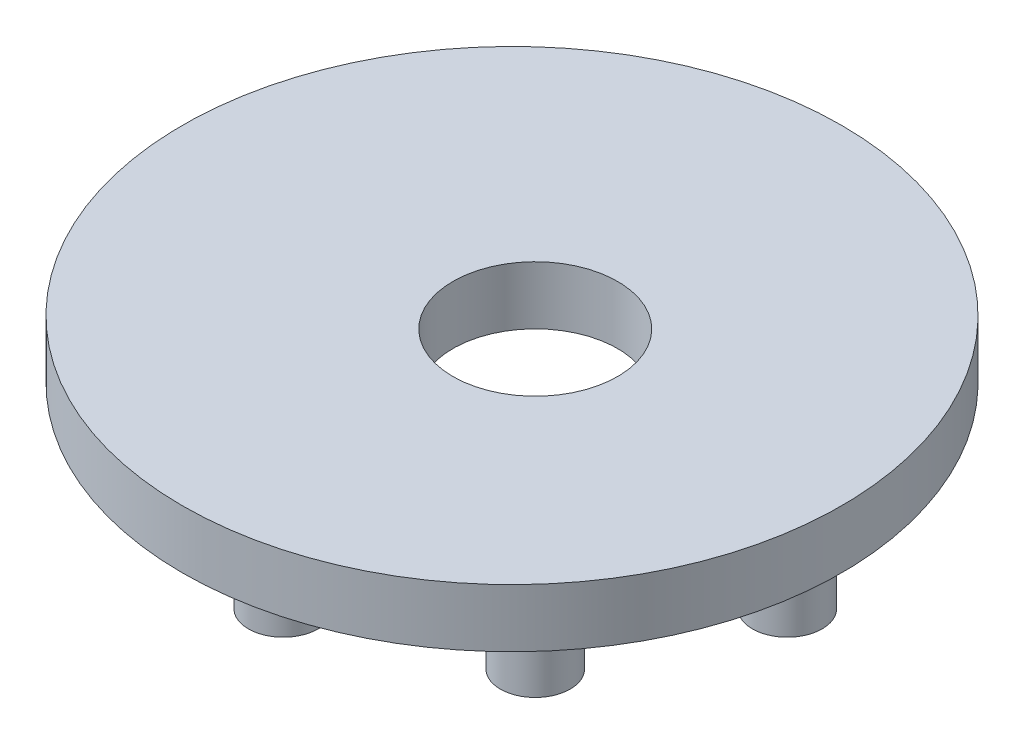
ISO-10303-21;
HEADER;
FILE_DESCRIPTION(('STEP AP214'),'2;1');
FILE_NAME('part.step','',(''),(''),'','','');
FILE_SCHEMA(('AUTOMOTIVE_DESIGN { 1 0 10303 214 1 1 1 1 }'));
ENDSEC;
DATA;
#1=APPLICATION_CONTEXT('core data for automotive mechanical design processes');
#2=APPLICATION_PROTOCOL_DEFINITION('international standard','automotive_design',2000,#1);
#3=PRODUCT_CONTEXT('',#1,'mechanical');
#4=PRODUCT('Part','Part','',(#3));
#5=PRODUCT_RELATED_PRODUCT_CATEGORY('part','',(#4));
#6=PRODUCT_DEFINITION_FORMATION('','',#4);
#7=PRODUCT_DEFINITION_CONTEXT('part definition',#1,'design');
#8=PRODUCT_DEFINITION('design','',#6,#7);
#9=PRODUCT_DEFINITION_SHAPE('','',#8);
#10=(LENGTH_UNIT() NAMED_UNIT(*) SI_UNIT(.MILLI.,.METRE.));
#11=(NAMED_UNIT(*) PLANE_ANGLE_UNIT() SI_UNIT($,.RADIAN.));
#12=(NAMED_UNIT(*) SI_UNIT($,.STERADIAN.) SOLID_ANGLE_UNIT());
#13=UNCERTAINTY_MEASURE_WITH_UNIT(LENGTH_MEASURE(1.E-05),#10,'distance_accuracy_value','');
#14=(GEOMETRIC_REPRESENTATION_CONTEXT(3) GLOBAL_UNCERTAINTY_ASSIGNED_CONTEXT((#13)) GLOBAL_UNIT_ASSIGNED_CONTEXT((#10,
#11,#12)) REPRESENTATION_CONTEXT('',''));
#15=CARTESIAN_POINT('',(0.,0.,0.));
#16=DIRECTION('',(0.,0.,1.));
#17=DIRECTION('',(1.,0.,0.));
#18=AXIS2_PLACEMENT_3D('',#15,#16,#17);
#19=CARTESIAN_POINT('',(0.,3.,0.));
#20=DIRECTION('',(0.,1.,0.));
#21=DIRECTION('',(0.,0.,1.));
#22=AXIS2_PLACEMENT_3D('',#19,#20,#21);
#23=PLANE('',#22);
#24=CARTESIAN_POINT('',(1.2,3.,0.));
#25=DIRECTION('',(0.,1.,0.));
#26=DIRECTION('',(0.,0.,1.));
#27=AXIS2_PLACEMENT_3D('',#24,#25,#26);
#28=CIRCLE('',#27,4.25);
#29=CARTESIAN_POINT('',(1.2,3.,4.25));
#30=VERTEX_POINT('',#29);
#31=EDGE_CURVE('E44',#30,#30,#28,.T.);
#32=ORIENTED_EDGE('',*,*,#31,.F.);
#33=EDGE_LOOP('',(#32));
#34=FACE_BOUND('',#33,.T.);
#35=CARTESIAN_POINT('',(0.,3.,0.));
#36=DIRECTION('',(0.,1.,0.));
#37=DIRECTION('',(0.,0.,1.));
#38=AXIS2_PLACEMENT_3D('',#35,#36,#37);
#39=CIRCLE('',#38,17.);
#40=CARTESIAN_POINT('',(0.,3.,17.));
#41=VERTEX_POINT('',#40);
#42=EDGE_CURVE('E11',#41,#41,#39,.T.);
#43=ORIENTED_EDGE('',*,*,#42,.T.);
#44=EDGE_LOOP('',(#43));
#45=FACE_BOUND('',#44,.T.);
#46=ADVANCED_FACE('F33',(#34,#45),#23,.T.);
#47=CARTESIAN_POINT('',(0.,0.,0.));
#48=DIRECTION('',(0.,1.,0.));
#49=DIRECTION('',(0.,0.,1.));
#50=AXIS2_PLACEMENT_3D('',#47,#48,#49);
#51=PLANE('',#50);
#52=CARTESIAN_POINT('',(0.,0.,0.));
#53=DIRECTION('',(0.,1.,0.));
#54=DIRECTION('',(0.,0.,1.));
#55=AXIS2_PLACEMENT_3D('',#52,#53,#54);
#56=CIRCLE('',#55,17.);
#57=CARTESIAN_POINT('',(0.,0.,17.));
#58=VERTEX_POINT('',#57);
#59=EDGE_CURVE('E37',#58,#58,#56,.T.);
#60=ORIENTED_EDGE('',*,*,#59,.F.);
#61=EDGE_LOOP('',(#60));
#62=FACE_BOUND('',#61,.T.);
#63=CARTESIAN_POINT('',(-7.99238815542512,0.,-9.19238815542512));
#64=DIRECTION('',(0.,1.,0.));
#65=DIRECTION('',(0.,0.,1.));
#66=AXIS2_PLACEMENT_3D('',#63,#64,#65);
#67=CIRCLE('',#66,1.8);
#68=CARTESIAN_POINT('',(-7.99238815542512,0.,-7.39238815542512));
#69=VERTEX_POINT('',#68);
#70=EDGE_CURVE('E49',#69,#69,#67,.T.);
#71=ORIENTED_EDGE('',*,*,#70,.T.);
#72=EDGE_LOOP('',(#71));
#73=FACE_BOUND('',#72,.T.);
#74=CARTESIAN_POINT('',(1.2,0.,0.));
#75=DIRECTION('',(0.,1.,0.));
#76=DIRECTION('',(0.,0.,1.));
#77=AXIS2_PLACEMENT_3D('',#74,#75,#76);
#78=CIRCLE('',#77,4.25);
#79=CARTESIAN_POINT('',(1.2,0.,4.25));
#80=VERTEX_POINT('',#79);
#81=EDGE_CURVE('E46',#80,#80,#78,.T.);
#82=ORIENTED_EDGE('',*,*,#81,.T.);
#83=EDGE_LOOP('',(#82));
#84=FACE_BOUND('',#83,.T.);
#85=CARTESIAN_POINT('',(1.19999999999984,0.,-13.));
#86=DIRECTION('',(0.,1.,0.));
#87=DIRECTION('',(0.,0.,1.));
#88=AXIS2_PLACEMENT_3D('',#85,#86,#87);
#89=CIRCLE('',#88,1.8);
#90=CARTESIAN_POINT('',(1.19999999999984,0.,-11.2));
#91=VERTEX_POINT('',#90);
#92=EDGE_CURVE('E93',#91,#91,#89,.T.);
#93=ORIENTED_EDGE('',*,*,#92,.T.);
#94=EDGE_LOOP('',(#93));
#95=FACE_BOUND('',#94,.T.);
#96=CARTESIAN_POINT('',(10.392388155425,0.,-9.19238815542521));
#97=DIRECTION('',(0.,1.,0.));
#98=DIRECTION('',(0.,0.,1.));
#99=AXIS2_PLACEMENT_3D('',#96,#97,#98);
#100=CIRCLE('',#99,1.8);
#101=CARTESIAN_POINT('',(10.392388155425,0.,-7.39238815542521));
#102=VERTEX_POINT('',#101);
#103=EDGE_CURVE('E87',#102,#102,#100,.T.);
#104=ORIENTED_EDGE('',*,*,#103,.T.);
#105=EDGE_LOOP('',(#104));
#106=FACE_BOUND('',#105,.T.);
#107=CARTESIAN_POINT('',(14.2,0.,-1.12865446155741E-13));
#108=DIRECTION('',(0.,1.,0.));
#109=DIRECTION('',(0.,0.,1.));
#110=AXIS2_PLACEMENT_3D('',#107,#108,#109);
#111=CIRCLE('',#110,1.8);
#112=CARTESIAN_POINT('',(14.2,0.,1.79999999999989));
#113=VERTEX_POINT('',#112);
#114=EDGE_CURVE('E81',#113,#113,#111,.T.);
#115=ORIENTED_EDGE('',*,*,#114,.T.);
#116=EDGE_LOOP('',(#115));
#117=FACE_BOUND('',#116,.T.);
#118=CARTESIAN_POINT('',(10.3923881554251,0.,9.19238815542512));
#119=DIRECTION('',(0.,1.,0.));
#120=DIRECTION('',(0.,0.,1.));
#121=AXIS2_PLACEMENT_3D('',#118,#119,#120);
#122=CIRCLE('',#121,1.8);
#123=CARTESIAN_POINT('',(10.3923881554251,0.,10.9923881554251));
#124=VERTEX_POINT('',#123);
#125=EDGE_CURVE('E75',#124,#124,#122,.T.);
#126=ORIENTED_EDGE('',*,*,#125,.T.);
#127=EDGE_LOOP('',(#126));
#128=FACE_BOUND('',#127,.T.);
#129=CARTESIAN_POINT('',(1.20000000000007,0.,13.));
#130=DIRECTION('',(0.,1.,0.));
#131=DIRECTION('',(0.,0.,1.));
#132=AXIS2_PLACEMENT_3D('',#129,#130,#131);
#133=CIRCLE('',#132,1.8);
#134=CARTESIAN_POINT('',(1.20000000000007,0.,14.8));
#135=VERTEX_POINT('',#134);
#136=EDGE_CURVE('E69',#135,#135,#133,.T.);
#137=ORIENTED_EDGE('',*,*,#136,.T.);
#138=EDGE_LOOP('',(#137));
#139=FACE_BOUND('',#138,.T.);
#140=CARTESIAN_POINT('',(-7.99238815542509,0.,9.19238815542515));
#141=DIRECTION('',(0.,1.,0.));
#142=DIRECTION('',(0.,0.,1.));
#143=AXIS2_PLACEMENT_3D('',#140,#141,#142);
#144=CIRCLE('',#143,1.8);
#145=CARTESIAN_POINT('',(-7.99238815542509,0.,10.9923881554251));
#146=VERTEX_POINT('',#145);
#147=EDGE_CURVE('E63',#146,#146,#144,.T.);
#148=ORIENTED_EDGE('',*,*,#147,.T.);
#149=EDGE_LOOP('',(#148));
#150=FACE_BOUND('',#149,.T.);
#151=CARTESIAN_POINT('',(-11.8,0.,0.));
#152=DIRECTION('',(0.,1.,0.));
#153=DIRECTION('',(0.,0.,1.));
#154=AXIS2_PLACEMENT_3D('',#151,#152,#153);
#155=CIRCLE('',#154,1.8);
#156=CARTESIAN_POINT('',(-11.8,0.,1.80000000000002));
#157=VERTEX_POINT('',#156);
#158=EDGE_CURVE('E57',#157,#157,#155,.T.);
#159=ORIENTED_EDGE('',*,*,#158,.T.);
#160=EDGE_LOOP('',(#159));
#161=FACE_BOUND('',#160,.T.);
#162=ADVANCED_FACE('F109',(#62,#73,#84,#95,#106,#117,#128,#139,#150,#161),#51,.F.);
#163=CARTESIAN_POINT('',(0.,3.,0.));
#164=DIRECTION('',(0.,-1.,0.));
#165=DIRECTION('',(0.,0.,-1.));
#166=AXIS2_PLACEMENT_3D('',#163,#164,#165);
#167=CYLINDRICAL_SURFACE('',#166,17.);
#168=ORIENTED_EDGE('',*,*,#42,.F.);
#169=EDGE_LOOP('',(#168));
#170=FACE_BOUND('',#169,.T.);
#171=ORIENTED_EDGE('',*,*,#59,.T.);
#172=EDGE_LOOP('',(#171));
#173=FACE_BOUND('',#172,.T.);
#174=ADVANCED_FACE('F35',(#170,#173),#167,.T.);
#175=CARTESIAN_POINT('',(1.2,3.,0.));
#176=DIRECTION('',(0.,-1.,0.));
#177=DIRECTION('',(0.,0.,-1.));
#178=AXIS2_PLACEMENT_3D('',#175,#176,#177);
#179=CYLINDRICAL_SURFACE('',#178,4.25);
#180=ORIENTED_EDGE('',*,*,#31,.T.);
#181=EDGE_LOOP('',(#180));
#182=FACE_BOUND('',#181,.T.);
#183=ORIENTED_EDGE('',*,*,#81,.F.);
#184=EDGE_LOOP('',(#183));
#185=FACE_BOUND('',#184,.T.);
#186=ADVANCED_FACE('F149',(#182,#185),#179,.F.);
#187=CARTESIAN_POINT('',(-7.99238815542512,-11.0911688245431,-9.19238815542512));
#188=DIRECTION('',(0.,1.,0.));
#189=DIRECTION('',(0.,0.,1.));
#190=AXIS2_PLACEMENT_3D('',#187,#188,#189);
#191=CYLINDRICAL_SURFACE('',#190,1.8);
#192=CARTESIAN_POINT('',(-7.99238815542512,-3.,-9.19238815542512));
#193=DIRECTION('',(0.,1.,0.));
#194=DIRECTION('',(0.,0.,1.));
#195=AXIS2_PLACEMENT_3D('',#192,#193,#194);
#196=CIRCLE('',#195,1.8);
#197=CARTESIAN_POINT('',(-7.99238815542512,-3.,-7.39238815542512));
#198=VERTEX_POINT('',#197);
#199=EDGE_CURVE('E54',#198,#198,#196,.F.);
#200=ORIENTED_EDGE('',*,*,#199,.F.);
#201=EDGE_LOOP('',(#200));
#202=FACE_BOUND('',#201,.T.);
#203=ORIENTED_EDGE('',*,*,#70,.F.);
#204=EDGE_LOOP('',(#203));
#205=FACE_BOUND('',#204,.T.);
#206=ADVANCED_FACE('F138',(#202,#205),#191,.T.);
#207=CARTESIAN_POINT('',(0.,-3.,0.));
#208=DIRECTION('',(0.,1.,0.));
#209=DIRECTION('',(0.,0.,1.));
#210=AXIS2_PLACEMENT_3D('',#207,#208,#209);
#211=PLANE('',#210);
#212=ORIENTED_EDGE('',*,*,#199,.T.);
#213=EDGE_LOOP('',(#212));
#214=FACE_BOUND('',#213,.T.);
#215=ADVANCED_FACE('F128',(#214),#211,.F.);
#216=CARTESIAN_POINT('',(-11.8,-11.0911688245431,0.));
#217=DIRECTION('',(0.,1.,0.));
#218=DIRECTION('',(0.,0.,1.));
#219=AXIS2_PLACEMENT_3D('',#216,#217,#218);
#220=CYLINDRICAL_SURFACE('',#219,1.8);
#221=CARTESIAN_POINT('',(-11.8,-3.,0.));
#222=DIRECTION('',(0.,1.,0.));
#223=DIRECTION('',(0.,0.,1.));
#224=AXIS2_PLACEMENT_3D('',#221,#222,#223);
#225=CIRCLE('',#224,1.8);
#226=CARTESIAN_POINT('',(-11.8,-3.,1.80000000000002));
#227=VERTEX_POINT('',#226);
#228=EDGE_CURVE('E60',#227,#227,#225,.F.);
#229=ORIENTED_EDGE('',*,*,#228,.F.);
#230=EDGE_LOOP('',(#229));
#231=FACE_BOUND('',#230,.T.);
#232=ORIENTED_EDGE('',*,*,#158,.F.);
#233=EDGE_LOOP('',(#232));
#234=FACE_BOUND('',#233,.T.);
#235=ADVANCED_FACE('F125',(#231,#234),#220,.T.);
#236=CARTESIAN_POINT('',(0.,-3.,0.));
#237=DIRECTION('',(0.,1.,0.));
#238=DIRECTION('',(0.,0.,1.));
#239=AXIS2_PLACEMENT_3D('',#236,#237,#238);
#240=PLANE('',#239);
#241=ORIENTED_EDGE('',*,*,#228,.T.);
#242=EDGE_LOOP('',(#241));
#243=FACE_BOUND('',#242,.T.);
#244=ADVANCED_FACE('F127',(#243),#240,.F.);
#245=CARTESIAN_POINT('',(-7.99238815542509,-11.0911688245431,9.19238815542515));
#246=DIRECTION('',(0.,1.,0.));
#247=DIRECTION('',(0.,0.,1.));
#248=AXIS2_PLACEMENT_3D('',#245,#246,#247);
#249=CYLINDRICAL_SURFACE('',#248,1.8);
#250=CARTESIAN_POINT('',(-7.99238815542509,-3.,9.19238815542515));
#251=DIRECTION('',(0.,1.,0.));
#252=DIRECTION('',(0.,0.,1.));
#253=AXIS2_PLACEMENT_3D('',#250,#251,#252);
#254=CIRCLE('',#253,1.8);
#255=CARTESIAN_POINT('',(-7.99238815542509,-3.,10.9923881554251));
#256=VERTEX_POINT('',#255);
#257=EDGE_CURVE('E66',#256,#256,#254,.F.);
#258=ORIENTED_EDGE('',*,*,#257,.F.);
#259=EDGE_LOOP('',(#258));
#260=FACE_BOUND('',#259,.T.);
#261=ORIENTED_EDGE('',*,*,#147,.F.);
#262=EDGE_LOOP('',(#261));
#263=FACE_BOUND('',#262,.T.);
#264=ADVANCED_FACE('F135',(#260,#263),#249,.T.);
#265=CARTESIAN_POINT('',(0.,-3.,0.));
#266=DIRECTION('',(0.,1.,0.));
#267=DIRECTION('',(0.,0.,1.));
#268=AXIS2_PLACEMENT_3D('',#265,#266,#267);
#269=PLANE('',#268);
#270=ORIENTED_EDGE('',*,*,#257,.T.);
#271=EDGE_LOOP('',(#270));
#272=FACE_BOUND('',#271,.T.);
#273=ADVANCED_FACE('F196',(#272),#269,.F.);
#274=CARTESIAN_POINT('',(1.20000000000007,-11.0911688245431,13.));
#275=DIRECTION('',(0.,1.,0.));
#276=DIRECTION('',(0.,0.,1.));
#277=AXIS2_PLACEMENT_3D('',#274,#275,#276);
#278=CYLINDRICAL_SURFACE('',#277,1.8);
#279=CARTESIAN_POINT('',(1.20000000000007,-3.,13.));
#280=DIRECTION('',(0.,1.,0.));
#281=DIRECTION('',(0.,0.,1.));
#282=AXIS2_PLACEMENT_3D('',#279,#280,#281);
#283=CIRCLE('',#282,1.8);
#284=CARTESIAN_POINT('',(1.20000000000007,-3.,14.8));
#285=VERTEX_POINT('',#284);
#286=EDGE_CURVE('E72',#285,#285,#283,.F.);
#287=ORIENTED_EDGE('',*,*,#286,.F.);
#288=EDGE_LOOP('',(#287));
#289=FACE_BOUND('',#288,.T.);
#290=ORIENTED_EDGE('',*,*,#136,.F.);
#291=EDGE_LOOP('',(#290));
#292=FACE_BOUND('',#291,.T.);
#293=ADVANCED_FACE('F206',(#289,#292),#278,.T.);
#294=CARTESIAN_POINT('',(0.,-3.,0.));
#295=DIRECTION('',(0.,1.,0.));
#296=DIRECTION('',(0.,0.,1.));
#297=AXIS2_PLACEMENT_3D('',#294,#295,#296);
#298=PLANE('',#297);
#299=ORIENTED_EDGE('',*,*,#286,.T.);
#300=EDGE_LOOP('',(#299));
#301=FACE_BOUND('',#300,.T.);
#302=ADVANCED_FACE('F216',(#301),#298,.F.);
#303=CARTESIAN_POINT('',(10.3923881554251,-11.0911688245431,9.19238815542512));
#304=DIRECTION('',(0.,1.,0.));
#305=DIRECTION('',(0.,0.,1.));
#306=AXIS2_PLACEMENT_3D('',#303,#304,#305);
#307=CYLINDRICAL_SURFACE('',#306,1.8);
#308=CARTESIAN_POINT('',(10.3923881554251,-3.,9.19238815542512));
#309=DIRECTION('',(0.,1.,0.));
#310=DIRECTION('',(0.,0.,1.));
#311=AXIS2_PLACEMENT_3D('',#308,#309,#310);
#312=CIRCLE('',#311,1.8);
#313=CARTESIAN_POINT('',(10.3923881554251,-3.,10.9923881554251));
#314=VERTEX_POINT('',#313);
#315=EDGE_CURVE('E78',#314,#314,#312,.F.);
#316=ORIENTED_EDGE('',*,*,#315,.F.);
#317=EDGE_LOOP('',(#316));
#318=FACE_BOUND('',#317,.T.);
#319=ORIENTED_EDGE('',*,*,#125,.F.);
#320=EDGE_LOOP('',(#319));
#321=FACE_BOUND('',#320,.T.);
#322=ADVANCED_FACE('F226',(#318,#321),#307,.T.);
#323=CARTESIAN_POINT('',(0.,-3.,0.));
#324=DIRECTION('',(0.,1.,0.));
#325=DIRECTION('',(0.,0.,1.));
#326=AXIS2_PLACEMENT_3D('',#323,#324,#325);
#327=PLANE('',#326);
#328=ORIENTED_EDGE('',*,*,#315,.T.);
#329=EDGE_LOOP('',(#328));
#330=FACE_BOUND('',#329,.T.);
#331=ADVANCED_FACE('F236',(#330),#327,.F.);
#332=CARTESIAN_POINT('',(14.2,-11.0911688245431,-1.12865446155741E-13));
#333=DIRECTION('',(0.,1.,0.));
#334=DIRECTION('',(0.,0.,1.));
#335=AXIS2_PLACEMENT_3D('',#332,#333,#334);
#336=CYLINDRICAL_SURFACE('',#335,1.8);
#337=CARTESIAN_POINT('',(14.2,-3.,-1.12865446155741E-13));
#338=DIRECTION('',(0.,1.,0.));
#339=DIRECTION('',(0.,0.,1.));
#340=AXIS2_PLACEMENT_3D('',#337,#338,#339);
#341=CIRCLE('',#340,1.8);
#342=CARTESIAN_POINT('',(14.2,-3.,1.79999999999989));
#343=VERTEX_POINT('',#342);
#344=EDGE_CURVE('E84',#343,#343,#341,.F.);
#345=ORIENTED_EDGE('',*,*,#344,.F.);
#346=EDGE_LOOP('',(#345));
#347=FACE_BOUND('',#346,.T.);
#348=ORIENTED_EDGE('',*,*,#114,.F.);
#349=EDGE_LOOP('',(#348));
#350=FACE_BOUND('',#349,.T.);
#351=ADVANCED_FACE('F246',(#347,#350),#336,.T.);
#352=CARTESIAN_POINT('',(0.,-3.,0.));
#353=DIRECTION('',(0.,1.,0.));
#354=DIRECTION('',(0.,0.,1.));
#355=AXIS2_PLACEMENT_3D('',#352,#353,#354);
#356=PLANE('',#355);
#357=ORIENTED_EDGE('',*,*,#344,.T.);
#358=EDGE_LOOP('',(#357));
#359=FACE_BOUND('',#358,.T.);
#360=ADVANCED_FACE('F256',(#359),#356,.F.);
#361=CARTESIAN_POINT('',(10.392388155425,-11.0911688245431,-9.19238815542521));
#362=DIRECTION('',(0.,1.,0.));
#363=DIRECTION('',(0.,0.,1.));
#364=AXIS2_PLACEMENT_3D('',#361,#362,#363);
#365=CYLINDRICAL_SURFACE('',#364,1.8);
#366=CARTESIAN_POINT('',(10.392388155425,-3.,-9.19238815542521));
#367=DIRECTION('',(0.,1.,0.));
#368=DIRECTION('',(0.,0.,1.));
#369=AXIS2_PLACEMENT_3D('',#366,#367,#368);
#370=CIRCLE('',#369,1.8);
#371=CARTESIAN_POINT('',(10.392388155425,-3.,-7.39238815542521));
#372=VERTEX_POINT('',#371);
#373=EDGE_CURVE('E90',#372,#372,#370,.F.);
#374=ORIENTED_EDGE('',*,*,#373,.F.);
#375=EDGE_LOOP('',(#374));
#376=FACE_BOUND('',#375,.T.);
#377=ORIENTED_EDGE('',*,*,#103,.F.);
#378=EDGE_LOOP('',(#377));
#379=FACE_BOUND('',#378,.T.);
#380=ADVANCED_FACE('F266',(#376,#379),#365,.T.);
#381=CARTESIAN_POINT('',(0.,-3.,0.));
#382=DIRECTION('',(0.,1.,0.));
#383=DIRECTION('',(0.,0.,1.));
#384=AXIS2_PLACEMENT_3D('',#381,#382,#383);
#385=PLANE('',#384);
#386=ORIENTED_EDGE('',*,*,#373,.T.);
#387=EDGE_LOOP('',(#386));
#388=FACE_BOUND('',#387,.T.);
#389=ADVANCED_FACE('F105',(#388),#385,.F.);
#390=CARTESIAN_POINT('',(1.19999999999984,-11.0911688245431,-13.));
#391=DIRECTION('',(0.,1.,0.));
#392=DIRECTION('',(0.,0.,1.));
#393=AXIS2_PLACEMENT_3D('',#390,#391,#392);
#394=CYLINDRICAL_SURFACE('',#393,1.8);
#395=CARTESIAN_POINT('',(1.19999999999984,-3.,-13.));
#396=DIRECTION('',(0.,1.,0.));
#397=DIRECTION('',(0.,0.,1.));
#398=AXIS2_PLACEMENT_3D('',#395,#396,#397);
#399=CIRCLE('',#398,1.8);
#400=CARTESIAN_POINT('',(1.19999999999984,-3.,-11.2));
#401=VERTEX_POINT('',#400);
#402=EDGE_CURVE('E96',#401,#401,#399,.F.);
#403=ORIENTED_EDGE('',*,*,#402,.F.);
#404=EDGE_LOOP('',(#403));
#405=FACE_BOUND('',#404,.T.);
#406=ORIENTED_EDGE('',*,*,#92,.F.);
#407=EDGE_LOOP('',(#406));
#408=FACE_BOUND('',#407,.T.);
#409=ADVANCED_FACE('F102',(#405,#408),#394,.T.);
#410=CARTESIAN_POINT('',(0.,-3.,0.));
#411=DIRECTION('',(0.,1.,0.));
#412=DIRECTION('',(0.,0.,1.));
#413=AXIS2_PLACEMENT_3D('',#410,#411,#412);
#414=PLANE('',#413);
#415=ORIENTED_EDGE('',*,*,#402,.T.);
#416=EDGE_LOOP('',(#415));
#417=FACE_BOUND('',#416,.T.);
#418=ADVANCED_FACE('F100',(#417),#414,.F.);
#419=CLOSED_SHELL('',(#46,#162,#174,#186,#206,#215,#235,#244,#264,#273,#293,#302,#322,#331,#351,
#360,#380,#389,#409,#418));
#420=MANIFOLD_SOLID_BREP('B2',#419);
#421=ADVANCED_BREP_SHAPE_REPRESENTATION('',(#18,#420),#14);
#422=SHAPE_DEFINITION_REPRESENTATION(#9,#421);
ENDSEC;
END-ISO-10303-21;
